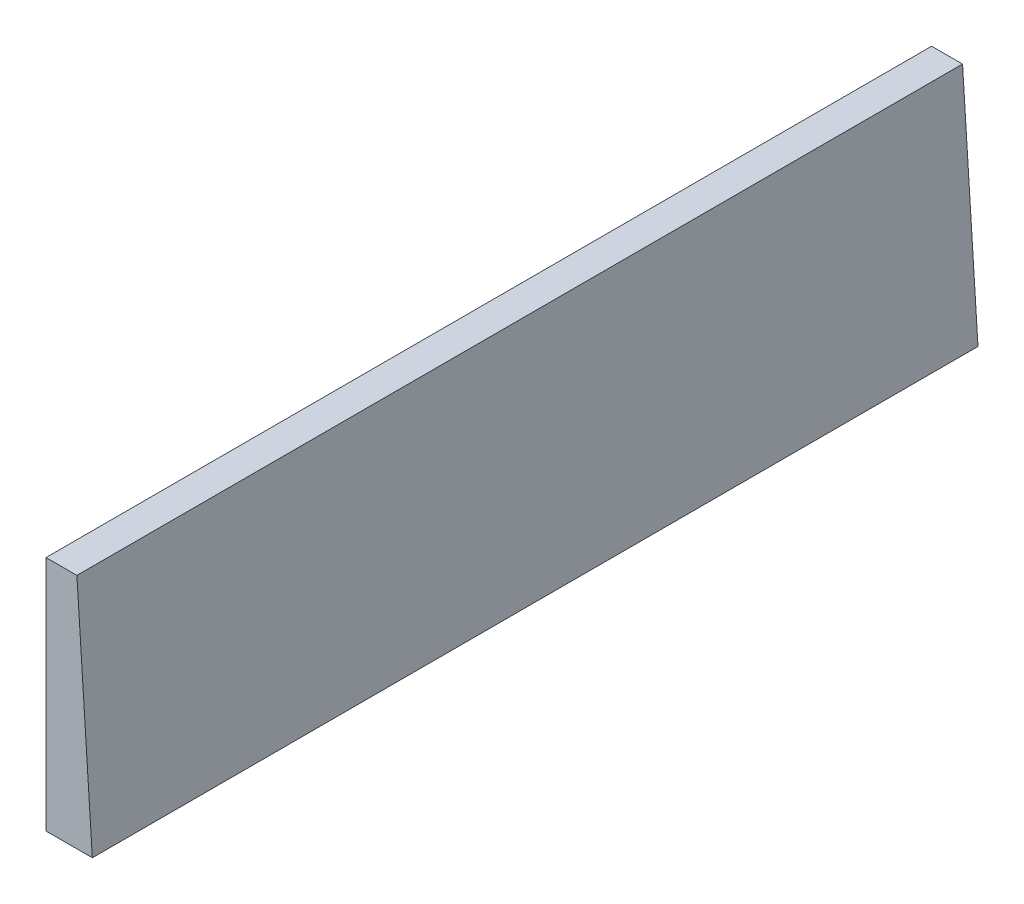
ISO-10303-21;
HEADER;
FILE_DESCRIPTION(('STEP AP214'),'2;1');
FILE_NAME('part.step','',(''),(''),'','','');
FILE_SCHEMA(('AUTOMOTIVE_DESIGN { 1 0 10303 214 1 1 1 1 }'));
ENDSEC;
DATA;
#1=APPLICATION_CONTEXT('core data for automotive mechanical design processes');
#2=APPLICATION_PROTOCOL_DEFINITION('international standard','automotive_design',2000,#1);
#3=PRODUCT_CONTEXT('',#1,'mechanical');
#4=PRODUCT('Part','Part','',(#3));
#5=PRODUCT_RELATED_PRODUCT_CATEGORY('part','',(#4));
#6=PRODUCT_DEFINITION_FORMATION('','',#4);
#7=PRODUCT_DEFINITION_CONTEXT('part definition',#1,'design');
#8=PRODUCT_DEFINITION('design','',#6,#7);
#9=PRODUCT_DEFINITION_SHAPE('','',#8);
#10=(LENGTH_UNIT() NAMED_UNIT(*) SI_UNIT(.MILLI.,.METRE.));
#11=(NAMED_UNIT(*) PLANE_ANGLE_UNIT() SI_UNIT($,.RADIAN.));
#12=(NAMED_UNIT(*) SI_UNIT($,.STERADIAN.) SOLID_ANGLE_UNIT());
#13=UNCERTAINTY_MEASURE_WITH_UNIT(LENGTH_MEASURE(1.E-05),#10,'distance_accuracy_value','');
#14=(GEOMETRIC_REPRESENTATION_CONTEXT(3) GLOBAL_UNCERTAINTY_ASSIGNED_CONTEXT((#13)) GLOBAL_UNIT_ASSIGNED_CONTEXT((#10,
#11,#12)) REPRESENTATION_CONTEXT('',''));
#15=CARTESIAN_POINT('',(0.,0.,0.));
#16=DIRECTION('',(0.,0.,1.));
#17=DIRECTION('',(1.,0.,0.));
#18=AXIS2_PLACEMENT_3D('',#15,#16,#17);
#19=CARTESIAN_POINT('',(0.,0.,-4300.));
#20=DIRECTION('',(-1.,0.,0.));
#21=DIRECTION('',(0.,0.,1.));
#22=AXIS2_PLACEMENT_3D('',#19,#20,#21);
#23=PLANE('',#22);
#24=DIRECTION('',(0.,0.,1.));
#25=VECTOR('',#24,1.);
#26=CARTESIAN_POINT('',(1.40834381901946E-13,-1150.,-4300.));
#27=LINE('',#26,#25);
#28=CARTESIAN_POINT('',(1.40834381901946E-13,-1150.,-4300.));
#29=VERTEX_POINT('',#28);
#30=CARTESIAN_POINT('',(1.40834381901946E-13,-1150.,4300.));
#31=VERTEX_POINT('',#30);
#32=EDGE_CURVE('E37',#29,#31,#27,.T.);
#33=ORIENTED_EDGE('',*,*,#32,.T.);
#34=DIRECTION('',(0.,-1.,0.));
#35=VECTOR('',#34,1.);
#36=CARTESIAN_POINT('',(0.,0.,4300.));
#37=LINE('',#36,#35);
#38=CARTESIAN_POINT('',(0.,1150.,4300.));
#39=VERTEX_POINT('',#38);
#40=EDGE_CURVE('E77',#39,#31,#37,.T.);
#41=ORIENTED_EDGE('',*,*,#40,.F.);
#42=DIRECTION('',(0.,0.,1.));
#43=VECTOR('',#42,1.);
#44=CARTESIAN_POINT('',(0.,1150.,-4300.));
#45=LINE('',#44,#43);
#46=CARTESIAN_POINT('',(0.,1150.,-4300.));
#47=VERTEX_POINT('',#46);
#48=EDGE_CURVE('E11',#47,#39,#45,.T.);
#49=ORIENTED_EDGE('',*,*,#48,.F.);
#50=DIRECTION('',(0.,-1.,0.));
#51=VECTOR('',#50,1.);
#52=CARTESIAN_POINT('',(0.,0.,-4300.));
#53=LINE('',#52,#51);
#54=EDGE_CURVE('E50',#47,#29,#53,.T.);
#55=ORIENTED_EDGE('',*,*,#54,.T.);
#56=EDGE_LOOP('',(#33,#41,#49,#55));
#57=FACE_BOUND('',#56,.T.);
#58=ADVANCED_FACE('F33',(#57),#23,.T.);
#59=CARTESIAN_POINT('',(0.,1150.,-4300.));
#60=DIRECTION('',(0.,1.,0.));
#61=DIRECTION('',(0.,0.,1.));
#62=AXIS2_PLACEMENT_3D('',#59,#60,#61);
#63=PLANE('',#62);
#64=ORIENTED_EDGE('',*,*,#48,.T.);
#65=DIRECTION('',(-1.,0.,0.));
#66=VECTOR('',#65,1.);
#67=CARTESIAN_POINT('',(0.,1150.,4300.));
#68=LINE('',#67,#66);
#69=CARTESIAN_POINT('',(300.,1150.,4300.));
#70=VERTEX_POINT('',#69);
#71=EDGE_CURVE('E91',#70,#39,#68,.T.);
#72=ORIENTED_EDGE('',*,*,#71,.F.);
#73=DIRECTION('',(0.,0.,1.));
#74=VECTOR('',#73,1.);
#75=CARTESIAN_POINT('',(300.,1150.,-4300.));
#76=LINE('',#75,#74);
#77=CARTESIAN_POINT('',(300.,1150.,-4300.));
#78=VERTEX_POINT('',#77);
#79=EDGE_CURVE('E42',#78,#70,#76,.T.);
#80=ORIENTED_EDGE('',*,*,#79,.F.);
#81=DIRECTION('',(-1.,0.,0.));
#82=VECTOR('',#81,1.);
#83=CARTESIAN_POINT('',(0.,1150.,-4300.));
#84=LINE('',#83,#82);
#85=EDGE_CURVE('E82',#78,#47,#84,.T.);
#86=ORIENTED_EDGE('',*,*,#85,.T.);
#87=EDGE_LOOP('',(#64,#72,#80,#86));
#88=FACE_BOUND('',#87,.T.);
#89=ADVANCED_FACE('F106',(#88),#63,.T.);
#90=CARTESIAN_POINT('',(450.,-1150.,-4300.));
#91=DIRECTION('',(0.997880105965818,0.0650791373455969,0.));
#92=DIRECTION('',(-0.0650791373455969,0.997880105965818,0.));
#93=AXIS2_PLACEMENT_3D('',#90,#91,#92);
#94=PLANE('',#93);
#95=ORIENTED_EDGE('',*,*,#79,.T.);
#96=DIRECTION('',(-0.0650791373455969,0.997880105965818,0.));
#97=VECTOR('',#96,1.);
#98=CARTESIAN_POINT('',(450.,-1150.,4300.));
#99=LINE('',#98,#97);
#100=CARTESIAN_POINT('',(450.,-1150.,4300.));
#101=VERTEX_POINT('',#100);
#102=EDGE_CURVE('E88',#101,#70,#99,.T.);
#103=ORIENTED_EDGE('',*,*,#102,.F.);
#104=DIRECTION('',(0.,0.,1.));
#105=VECTOR('',#104,1.);
#106=CARTESIAN_POINT('',(450.,-1150.,-4300.));
#107=LINE('',#106,#105);
#108=CARTESIAN_POINT('',(450.,-1150.,-4300.));
#109=VERTEX_POINT('',#108);
#110=EDGE_CURVE('E81',#109,#101,#107,.T.);
#111=ORIENTED_EDGE('',*,*,#110,.F.);
#112=DIRECTION('',(-0.0650791373455969,0.997880105965818,0.));
#113=VECTOR('',#112,1.);
#114=CARTESIAN_POINT('',(450.,-1150.,-4300.));
#115=LINE('',#114,#113);
#116=EDGE_CURVE('E99',#109,#78,#115,.T.);
#117=ORIENTED_EDGE('',*,*,#116,.T.);
#118=EDGE_LOOP('',(#95,#103,#111,#117));
#119=FACE_BOUND('',#118,.T.);
#120=ADVANCED_FACE('F104',(#119),#94,.T.);
#121=CARTESIAN_POINT('',(1.40834381901946E-13,-1150.,-4300.));
#122=DIRECTION('',(0.,-1.,0.));
#123=DIRECTION('',(0.,0.,-1.));
#124=AXIS2_PLACEMENT_3D('',#121,#122,#123);
#125=PLANE('',#124);
#126=ORIENTED_EDGE('',*,*,#110,.T.);
#127=DIRECTION('',(1.,0.,0.));
#128=VECTOR('',#127,1.);
#129=CARTESIAN_POINT('',(1.40834381901946E-13,-1150.,4300.));
#130=LINE('',#129,#128);
#131=EDGE_CURVE('E84',#31,#101,#130,.T.);
#132=ORIENTED_EDGE('',*,*,#131,.F.);
#133=ORIENTED_EDGE('',*,*,#32,.F.);
#134=DIRECTION('',(1.,0.,0.));
#135=VECTOR('',#134,1.);
#136=CARTESIAN_POINT('',(1.40834381901946E-13,-1150.,-4300.));
#137=LINE('',#136,#135);
#138=EDGE_CURVE('E97',#29,#109,#137,.T.);
#139=ORIENTED_EDGE('',*,*,#138,.T.);
#140=EDGE_LOOP('',(#126,#132,#133,#139));
#141=FACE_BOUND('',#140,.T.);
#142=ADVANCED_FACE('F35',(#141),#125,.T.);
#143=CARTESIAN_POINT('',(0.,0.,-4300.));
#144=DIRECTION('',(0.,0.,1.));
#145=DIRECTION('',(1.,0.,0.));
#146=AXIS2_PLACEMENT_3D('',#143,#144,#145);
#147=PLANE('',#146);
#148=ORIENTED_EDGE('',*,*,#54,.F.);
#149=ORIENTED_EDGE('',*,*,#85,.F.);
#150=ORIENTED_EDGE('',*,*,#116,.F.);
#151=ORIENTED_EDGE('',*,*,#138,.F.);
#152=EDGE_LOOP('',(#148,#149,#150,#151));
#153=FACE_BOUND('',#152,.T.);
#154=ADVANCED_FACE('F107',(#153),#147,.F.);
#155=CARTESIAN_POINT('',(0.,0.,4300.));
#156=DIRECTION('',(0.,0.,1.));
#157=DIRECTION('',(1.,0.,0.));
#158=AXIS2_PLACEMENT_3D('',#155,#156,#157);
#159=PLANE('',#158);
#160=ORIENTED_EDGE('',*,*,#40,.T.);
#161=ORIENTED_EDGE('',*,*,#131,.T.);
#162=ORIENTED_EDGE('',*,*,#102,.T.);
#163=ORIENTED_EDGE('',*,*,#71,.T.);
#164=EDGE_LOOP('',(#160,#161,#162,#163));
#165=FACE_BOUND('',#164,.T.);
#166=ADVANCED_FACE('F90',(#165),#159,.T.);
#167=CLOSED_SHELL('',(#58,#89,#120,#142,#154,#166));
#168=MANIFOLD_SOLID_BREP('B2',#167);
#169=ADVANCED_BREP_SHAPE_REPRESENTATION('',(#18,#168),#14);
#170=SHAPE_DEFINITION_REPRESENTATION(#9,#169);
ENDSEC;
END-ISO-10303-21;
